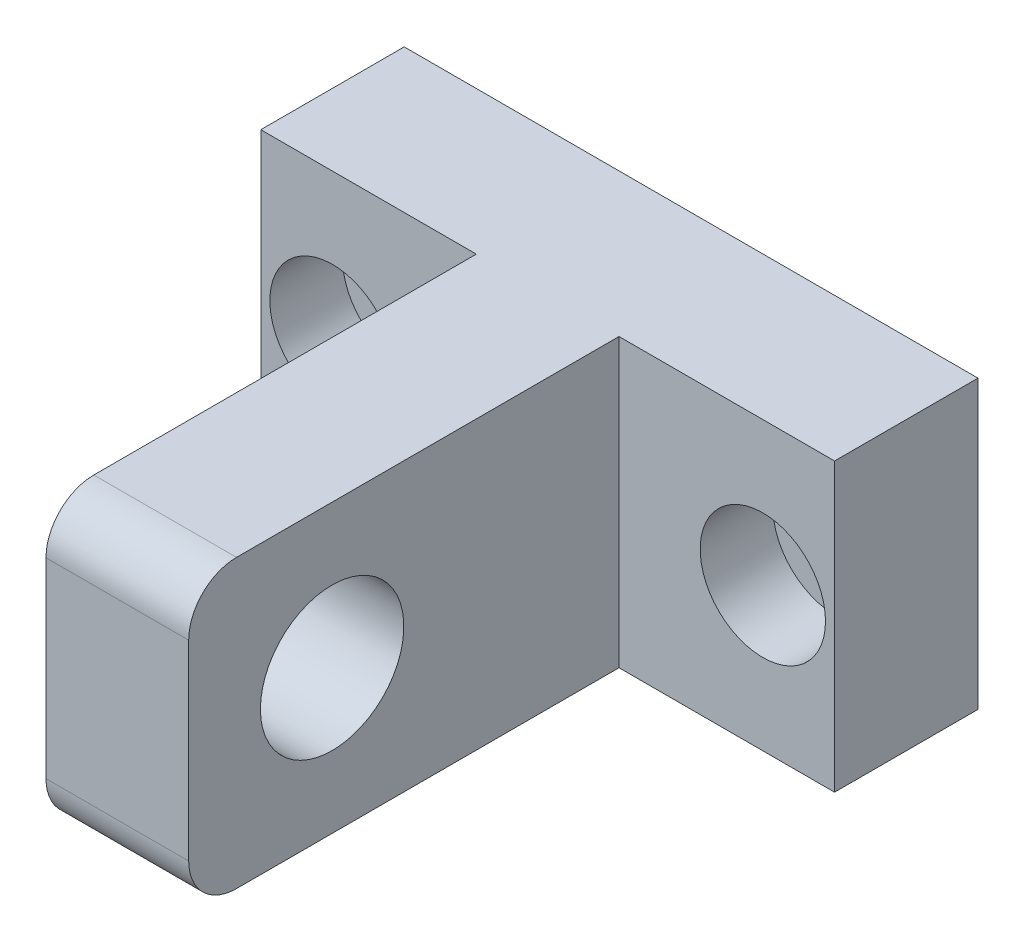
ISO-10303-21;
HEADER;
FILE_DESCRIPTION(('STEP AP214'),'2;1');
FILE_NAME('part.step','',(''),(''),'','','');
FILE_SCHEMA(('AUTOMOTIVE_DESIGN { 1 0 10303 214 1 1 1 1 }'));
ENDSEC;
DATA;
#1=APPLICATION_CONTEXT('core data for automotive mechanical design processes');
#2=APPLICATION_PROTOCOL_DEFINITION('international standard','automotive_design',2000,#1);
#3=PRODUCT_CONTEXT('',#1,'mechanical');
#4=PRODUCT('Part','Part','',(#3));
#5=PRODUCT_RELATED_PRODUCT_CATEGORY('part','',(#4));
#6=PRODUCT_DEFINITION_FORMATION('','',#4);
#7=PRODUCT_DEFINITION_CONTEXT('part definition',#1,'design');
#8=PRODUCT_DEFINITION('design','',#6,#7);
#9=PRODUCT_DEFINITION_SHAPE('','',#8);
#10=(LENGTH_UNIT() NAMED_UNIT(*) SI_UNIT(.MILLI.,.METRE.));
#11=(NAMED_UNIT(*) PLANE_ANGLE_UNIT() SI_UNIT($,.RADIAN.));
#12=(NAMED_UNIT(*) SI_UNIT($,.STERADIAN.) SOLID_ANGLE_UNIT());
#13=UNCERTAINTY_MEASURE_WITH_UNIT(LENGTH_MEASURE(1.E-05),#10,'distance_accuracy_value','');
#14=(GEOMETRIC_REPRESENTATION_CONTEXT(3) GLOBAL_UNCERTAINTY_ASSIGNED_CONTEXT((#13)) GLOBAL_UNIT_ASSIGNED_CONTEXT((#10,
#11,#12)) REPRESENTATION_CONTEXT('',''));
#15=CARTESIAN_POINT('',(0.,0.,0.));
#16=DIRECTION('',(0.,0.,1.));
#17=DIRECTION('',(1.,0.,0.));
#18=AXIS2_PLACEMENT_3D('',#15,#16,#17);
#19=CARTESIAN_POINT('',(-19.05,-9.525,9.525));
#20=DIRECTION('',(0.,0.,1.));
#21=DIRECTION('',(1.,0.,0.));
#22=AXIS2_PLACEMENT_3D('',#19,#20,#21);
#23=PLANE('',#22);
#24=CARTESIAN_POINT('',(-14.2875,0.,9.525));
#25=DIRECTION('',(0.,0.,1.));
#26=DIRECTION('',(1.,0.,0.));
#27=AXIS2_PLACEMENT_3D('',#24,#25,#26);
#28=CIRCLE('',#27,4.16052);
#29=CARTESIAN_POINT('',(-10.12698,0.,9.525));
#30=VERTEX_POINT('',#29);
#31=EDGE_CURVE('E217',#30,#30,#28,.T.);
#32=ORIENTED_EDGE('',*,*,#31,.F.);
#33=EDGE_LOOP('',(#32));
#34=FACE_BOUND('',#33,.T.);
#35=DIRECTION('',(1.,0.,0.));
#36=VECTOR('',#35,1.);
#37=CARTESIAN_POINT('',(-19.05,-9.525,9.525));
#38=LINE('',#37,#36);
#39=CARTESIAN_POINT('',(-19.05,-9.525,9.525));
#40=VERTEX_POINT('',#39);
#41=CARTESIAN_POINT('',(-4.73710000000001,-9.525,9.525));
#42=VERTEX_POINT('',#41);
#43=EDGE_CURVE('E173',#40,#42,#38,.T.);
#44=ORIENTED_EDGE('',*,*,#43,.T.);
#45=DIRECTION('',(0.,1.,0.));
#46=VECTOR('',#45,1.);
#47=CARTESIAN_POINT('',(-4.7371,9.525,9.525));
#48=LINE('',#47,#46);
#49=CARTESIAN_POINT('',(-4.73710000000001,9.525,9.525));
#50=VERTEX_POINT('',#49);
#51=EDGE_CURVE('E147',#42,#50,#48,.T.);
#52=ORIENTED_EDGE('',*,*,#51,.T.);
#53=DIRECTION('',(-1.,0.,0.));
#54=VECTOR('',#53,1.);
#55=CARTESIAN_POINT('',(-19.05,9.525,9.525));
#56=LINE('',#55,#54);
#57=CARTESIAN_POINT('',(-19.05,9.525,9.525));
#58=VERTEX_POINT('',#57);
#59=EDGE_CURVE('E124',#50,#58,#56,.T.);
#60=ORIENTED_EDGE('',*,*,#59,.T.);
#61=DIRECTION('',(0.,-1.,0.));
#62=VECTOR('',#61,1.);
#63=CARTESIAN_POINT('',(-19.05,9.525,9.525));
#64=LINE('',#63,#62);
#65=EDGE_CURVE('E227',#58,#40,#64,.T.);
#66=ORIENTED_EDGE('',*,*,#65,.T.);
#67=EDGE_LOOP('',(#44,#52,#60,#66));
#68=FACE_BOUND('',#67,.T.);
#69=ADVANCED_FACE('F34',(#34,#68),#23,.T.);
#70=CARTESIAN_POINT('',(14.2875,0.,9.525));
#71=DIRECTION('',(0.,0.,-1.));
#72=DIRECTION('',(-1.,0.,0.));
#73=AXIS2_PLACEMENT_3D('',#70,#71,#72);
#74=CYLINDRICAL_SURFACE('',#73,2.53365);
#75=CARTESIAN_POINT('',(14.2875,0.,0.));
#76=DIRECTION('',(0.,0.,1.));
#77=DIRECTION('',(1.,0.,0.));
#78=AXIS2_PLACEMENT_3D('',#75,#76,#77);
#79=CIRCLE('',#78,2.53365);
#80=CARTESIAN_POINT('',(11.75385,0.,0.));
#81=VERTEX_POINT('',#80);
#82=EDGE_CURVE('E223',#81,#81,#79,.T.);
#83=CARTESIAN_POINT('',(14.2875,0.,4.699));
#84=DIRECTION('',(0.,0.,1.));
#85=DIRECTION('',(1.,0.,0.));
#86=AXIS2_PLACEMENT_3D('',#83,#84,#85);
#87=CIRCLE('',#86,2.53365);
#88=CARTESIAN_POINT('',(11.75385,0.,4.699));
#89=VERTEX_POINT('',#88);
#90=EDGE_CURVE('E211',#89,#89,#87,.T.);
#91=CARTESIAN_POINT('',(11.75385,0.,0.));
#92=CARTESIAN_POINT('',(11.75385,0.,0.0489479166666667));
#93=CARTESIAN_POINT('',(11.75385,0.,0.0978958333333335));
#94=CARTESIAN_POINT('',(11.75385,0.,0.195791666666667));
#95=CARTESIAN_POINT('',(11.75385,0.,0.244739583333334));
#96=CARTESIAN_POINT('',(11.75385,0.,0.342635416666667));
#97=CARTESIAN_POINT('',(11.75385,0.,0.391583333333334));
#98=CARTESIAN_POINT('',(11.75385,0.,0.489479166666668));
#99=CARTESIAN_POINT('',(11.75385,0.,0.538427083333334));
#100=CARTESIAN_POINT('',(11.75385,0.,0.636322916666667));
#101=CARTESIAN_POINT('',(11.75385,0.,0.685270833333333));
#102=CARTESIAN_POINT('',(11.75385,0.,0.783166666666666));
#103=CARTESIAN_POINT('',(11.75385,0.,0.832114583333333));
#104=CARTESIAN_POINT('',(11.75385,0.,0.930010416666667));
#105=CARTESIAN_POINT('',(11.75385,0.,0.978958333333333));
#106=CARTESIAN_POINT('',(11.75385,0.,1.07685416666667));
#107=CARTESIAN_POINT('',(11.75385,0.,1.12580208333333));
#108=CARTESIAN_POINT('',(11.75385,0.,1.22369791666667));
#109=CARTESIAN_POINT('',(11.75385,0.,1.27264583333333));
#110=CARTESIAN_POINT('',(11.75385,0.,1.37054166666667));
#111=CARTESIAN_POINT('',(11.75385,0.,1.41948958333333));
#112=CARTESIAN_POINT('',(11.75385,0.,1.51738541666667));
#113=CARTESIAN_POINT('',(11.75385,0.,1.56633333333333));
#114=CARTESIAN_POINT('',(11.75385,0.,1.66422916666667));
#115=CARTESIAN_POINT('',(11.75385,0.,1.71317708333333));
#116=CARTESIAN_POINT('',(11.75385,0.,1.81107291666667));
#117=CARTESIAN_POINT('',(11.75385,0.,1.86002083333333));
#118=CARTESIAN_POINT('',(11.75385,0.,1.95791666666667));
#119=CARTESIAN_POINT('',(11.75385,0.,2.00686458333333));
#120=CARTESIAN_POINT('',(11.75385,0.,2.10476041666667));
#121=CARTESIAN_POINT('',(11.75385,0.,2.15370833333333));
#122=CARTESIAN_POINT('',(11.75385,0.,2.25160416666667));
#123=CARTESIAN_POINT('',(11.75385,0.,2.30055208333333));
#124=CARTESIAN_POINT('',(11.75385,0.,2.39844791666667));
#125=CARTESIAN_POINT('',(11.75385,0.,2.44739583333333));
#126=CARTESIAN_POINT('',(11.75385,0.,2.54529166666667));
#127=CARTESIAN_POINT('',(11.75385,0.,2.59423958333333));
#128=CARTESIAN_POINT('',(11.75385,0.,2.69213541666667));
#129=CARTESIAN_POINT('',(11.75385,0.,2.74108333333333));
#130=CARTESIAN_POINT('',(11.75385,0.,2.83897916666667));
#131=CARTESIAN_POINT('',(11.75385,0.,2.88792708333333));
#132=CARTESIAN_POINT('',(11.75385,0.,2.98582291666667));
#133=CARTESIAN_POINT('',(11.75385,0.,3.03477083333333));
#134=CARTESIAN_POINT('',(11.75385,0.,3.13266666666667));
#135=CARTESIAN_POINT('',(11.75385,0.,3.18161458333333));
#136=CARTESIAN_POINT('',(11.75385,0.,3.27951041666667));
#137=CARTESIAN_POINT('',(11.75385,0.,3.32845833333333));
#138=CARTESIAN_POINT('',(11.75385,0.,3.42635416666667));
#139=CARTESIAN_POINT('',(11.75385,0.,3.47530208333333));
#140=CARTESIAN_POINT('',(11.75385,0.,3.57319791666667));
#141=CARTESIAN_POINT('',(11.75385,0.,3.62214583333333));
#142=CARTESIAN_POINT('',(11.75385,0.,3.72004166666667));
#143=CARTESIAN_POINT('',(11.75385,0.,3.76898958333333));
#144=CARTESIAN_POINT('',(11.75385,0.,3.86688541666667));
#145=CARTESIAN_POINT('',(11.75385,0.,3.91583333333333));
#146=CARTESIAN_POINT('',(11.75385,0.,4.01372916666667));
#147=CARTESIAN_POINT('',(11.75385,0.,4.06267708333333));
#148=CARTESIAN_POINT('',(11.75385,0.,4.16057291666667));
#149=CARTESIAN_POINT('',(11.75385,0.,4.20952083333333));
#150=CARTESIAN_POINT('',(11.75385,0.,4.30741666666667));
#151=CARTESIAN_POINT('',(11.75385,0.,4.35636458333333));
#152=CARTESIAN_POINT('',(11.75385,0.,4.45426041666667));
#153=CARTESIAN_POINT('',(11.75385,0.,4.50320833333333));
#154=CARTESIAN_POINT('',(11.75385,0.,4.60110416666667));
#155=CARTESIAN_POINT('',(11.75385,0.,4.65005208333333));
#156=CARTESIAN_POINT('',(11.75385,0.,4.699));
#157=B_SPLINE_CURVE_WITH_KNOTS('',3,(#91,#92,#93,#94,#95,#96,#97,#98,#99,#100,#101,#102,#103,
#104,#105,#106,#107,#108,#109,#110,#111,#112,#113,#114,#115,#116,#117,#118,#119,#120,#121,#122,
#123,#124,#125,#126,#127,#128,#129,#130,#131,#132,#133,#134,#135,#136,#137,#138,#139,#140,#141,
#142,#143,#144,#145,#146,#147,#148,#149,#150,#151,#152,#153,#154,#155,#156),.UNSPECIFIED.,.F.,
.F.,(4,2,2,2,2,2,2,2,2,2,2,2,2,2,2,2,2,2,2,2,2,2,2,2,2,2,2,2,2,2,2,2,4),(0.,0.14684375,
0.293687500000001,0.440531250000001,0.587375000000001,0.73421875,0.8810625,1.02790625,1.17475,
1.32159375,1.4684375,1.61528125,1.762125,1.90896875,2.0558125,2.20265625,2.3495,2.49634375,
2.6431875,2.79003125,2.936875,3.08371875,3.2305625,3.37740625,3.52425,3.67109375,3.8179375,
3.96478125,4.111625,4.25846875,4.4053125,4.55215625,4.699),.UNSPECIFIED.);
#158=EDGE_CURVE('BSEAM278',#81,#89,#157,.T.);
#159=ORIENTED_EDGE('',*,*,#82,.F.);
#160=ORIENTED_EDGE('',*,*,#90,.T.);
#161=ORIENTED_EDGE('',*,*,#158,.T.);
#162=ORIENTED_EDGE('',*,*,#158,.F.);
#163=EDGE_LOOP('',(#159,#161,#160,#162));
#164=FACE_BOUND('',#163,.T.);
#165=ADVANCED_FACE('F278',(#164),#74,.F.);
#166=CARTESIAN_POINT('',(-14.2875,0.,9.525));
#167=DIRECTION('',(0.,0.,-1.));
#168=DIRECTION('',(-1.,0.,0.));
#169=AXIS2_PLACEMENT_3D('',#166,#167,#168);
#170=CYLINDRICAL_SURFACE('',#169,2.53365);
#171=CARTESIAN_POINT('',(-14.2875,0.,0.));
#172=DIRECTION('',(0.,0.,1.));
#173=DIRECTION('',(1.,0.,0.));
#174=AXIS2_PLACEMENT_3D('',#171,#172,#173);
#175=CIRCLE('',#174,2.53365);
#176=CARTESIAN_POINT('',(-16.82115,0.,0.));
#177=VERTEX_POINT('',#176);
#178=EDGE_CURVE('E220',#177,#177,#175,.T.);
#179=CARTESIAN_POINT('',(-14.2875,0.,4.699));
#180=DIRECTION('',(0.,0.,1.));
#181=DIRECTION('',(1.,0.,0.));
#182=AXIS2_PLACEMENT_3D('',#179,#180,#181);
#183=CIRCLE('',#182,2.53365);
#184=CARTESIAN_POINT('',(-16.82115,0.,4.699));
#185=VERTEX_POINT('',#184);
#186=EDGE_CURVE('E216',#185,#185,#183,.T.);
#187=CARTESIAN_POINT('',(-16.82115,0.,0.));
#188=CARTESIAN_POINT('',(-16.82115,0.,0.0489479166666667));
#189=CARTESIAN_POINT('',(-16.82115,0.,0.0978958333333335));
#190=CARTESIAN_POINT('',(-16.82115,0.,0.195791666666667));
#191=CARTESIAN_POINT('',(-16.82115,0.,0.244739583333334));
#192=CARTESIAN_POINT('',(-16.82115,0.,0.342635416666667));
#193=CARTESIAN_POINT('',(-16.82115,0.,0.391583333333334));
#194=CARTESIAN_POINT('',(-16.82115,0.,0.489479166666668));
#195=CARTESIAN_POINT('',(-16.82115,0.,0.538427083333334));
#196=CARTESIAN_POINT('',(-16.82115,0.,0.636322916666667));
#197=CARTESIAN_POINT('',(-16.82115,0.,0.685270833333333));
#198=CARTESIAN_POINT('',(-16.82115,0.,0.783166666666666));
#199=CARTESIAN_POINT('',(-16.82115,0.,0.832114583333333));
#200=CARTESIAN_POINT('',(-16.82115,0.,0.930010416666667));
#201=CARTESIAN_POINT('',(-16.82115,0.,0.978958333333333));
#202=CARTESIAN_POINT('',(-16.82115,0.,1.07685416666667));
#203=CARTESIAN_POINT('',(-16.82115,0.,1.12580208333333));
#204=CARTESIAN_POINT('',(-16.82115,0.,1.22369791666667));
#205=CARTESIAN_POINT('',(-16.82115,0.,1.27264583333333));
#206=CARTESIAN_POINT('',(-16.82115,0.,1.37054166666667));
#207=CARTESIAN_POINT('',(-16.82115,0.,1.41948958333333));
#208=CARTESIAN_POINT('',(-16.82115,0.,1.51738541666667));
#209=CARTESIAN_POINT('',(-16.82115,0.,1.56633333333333));
#210=CARTESIAN_POINT('',(-16.82115,0.,1.66422916666667));
#211=CARTESIAN_POINT('',(-16.82115,0.,1.71317708333333));
#212=CARTESIAN_POINT('',(-16.82115,0.,1.81107291666667));
#213=CARTESIAN_POINT('',(-16.82115,0.,1.86002083333333));
#214=CARTESIAN_POINT('',(-16.82115,0.,1.95791666666667));
#215=CARTESIAN_POINT('',(-16.82115,0.,2.00686458333333));
#216=CARTESIAN_POINT('',(-16.82115,0.,2.10476041666667));
#217=CARTESIAN_POINT('',(-16.82115,0.,2.15370833333333));
#218=CARTESIAN_POINT('',(-16.82115,0.,2.25160416666667));
#219=CARTESIAN_POINT('',(-16.82115,0.,2.30055208333333));
#220=CARTESIAN_POINT('',(-16.82115,0.,2.39844791666667));
#221=CARTESIAN_POINT('',(-16.82115,0.,2.44739583333333));
#222=CARTESIAN_POINT('',(-16.82115,0.,2.54529166666667));
#223=CARTESIAN_POINT('',(-16.82115,0.,2.59423958333333));
#224=CARTESIAN_POINT('',(-16.82115,0.,2.69213541666667));
#225=CARTESIAN_POINT('',(-16.82115,0.,2.74108333333333));
#226=CARTESIAN_POINT('',(-16.82115,0.,2.83897916666667));
#227=CARTESIAN_POINT('',(-16.82115,0.,2.88792708333333));
#228=CARTESIAN_POINT('',(-16.82115,0.,2.98582291666667));
#229=CARTESIAN_POINT('',(-16.82115,0.,3.03477083333333));
#230=CARTESIAN_POINT('',(-16.82115,0.,3.13266666666667));
#231=CARTESIAN_POINT('',(-16.82115,0.,3.18161458333333));
#232=CARTESIAN_POINT('',(-16.82115,0.,3.27951041666667));
#233=CARTESIAN_POINT('',(-16.82115,0.,3.32845833333333));
#234=CARTESIAN_POINT('',(-16.82115,0.,3.42635416666667));
#235=CARTESIAN_POINT('',(-16.82115,0.,3.47530208333333));
#236=CARTESIAN_POINT('',(-16.82115,0.,3.57319791666667));
#237=CARTESIAN_POINT('',(-16.82115,0.,3.62214583333333));
#238=CARTESIAN_POINT('',(-16.82115,0.,3.72004166666667));
#239=CARTESIAN_POINT('',(-16.82115,0.,3.76898958333333));
#240=CARTESIAN_POINT('',(-16.82115,0.,3.86688541666667));
#241=CARTESIAN_POINT('',(-16.82115,0.,3.91583333333333));
#242=CARTESIAN_POINT('',(-16.82115,0.,4.01372916666667));
#243=CARTESIAN_POINT('',(-16.82115,0.,4.06267708333333));
#244=CARTESIAN_POINT('',(-16.82115,0.,4.16057291666667));
#245=CARTESIAN_POINT('',(-16.82115,0.,4.20952083333333));
#246=CARTESIAN_POINT('',(-16.82115,0.,4.30741666666667));
#247=CARTESIAN_POINT('',(-16.82115,0.,4.35636458333333));
#248=CARTESIAN_POINT('',(-16.82115,0.,4.45426041666667));
#249=CARTESIAN_POINT('',(-16.82115,0.,4.50320833333333));
#250=CARTESIAN_POINT('',(-16.82115,0.,4.60110416666667));
#251=CARTESIAN_POINT('',(-16.82115,0.,4.65005208333333));
#252=CARTESIAN_POINT('',(-16.82115,0.,4.699));
#253=B_SPLINE_CURVE_WITH_KNOTS('',3,(#187,#188,#189,#190,#191,#192,#193,#194,#195,#196,#197,
#198,#199,#200,#201,#202,#203,#204,#205,#206,#207,#208,#209,#210,#211,#212,#213,#214,#215,#216,
#217,#218,#219,#220,#221,#222,#223,#224,#225,#226,#227,#228,#229,#230,#231,#232,#233,#234,#235,
#236,#237,#238,#239,#240,#241,#242,#243,#244,#245,#246,#247,#248,#249,#250,#251,#252),
.UNSPECIFIED.,.F.,.F.,(4,2,2,2,2,2,2,2,2,2,2,2,2,2,2,2,2,2,2,2,2,2,2,2,2,2,2,2,2,2,2,2,4),(0.,
0.14684375,0.293687500000001,0.440531250000001,0.587375000000001,0.73421875,0.8810625,
1.02790625,1.17475,1.32159375,1.4684375,1.61528125,1.762125,1.90896875,2.0558125,2.20265625,
2.3495,2.49634375,2.6431875,2.79003125,2.936875,3.08371875,3.2305625,3.37740625,3.52425,
3.67109375,3.8179375,3.96478125,4.111625,4.25846875,4.4053125,4.55215625,4.699),.UNSPECIFIED.);
#254=EDGE_CURVE('BSEAM284',#177,#185,#253,.T.);
#255=ORIENTED_EDGE('',*,*,#178,.F.);
#256=ORIENTED_EDGE('',*,*,#186,.T.);
#257=ORIENTED_EDGE('',*,*,#254,.T.);
#258=ORIENTED_EDGE('',*,*,#254,.F.);
#259=EDGE_LOOP('',(#255,#257,#256,#258));
#260=FACE_BOUND('',#259,.T.);
#261=ADVANCED_FACE('F284',(#260),#170,.F.);
#262=DIRECTION('',(0.,1.,0.));
#263=VECTOR('',#262,1.);
#264=CARTESIAN_POINT('',(4.7371,9.525,9.525));
#265=LINE('',#264,#263);
#266=CARTESIAN_POINT('',(4.73709999999998,-9.525,9.525));
#267=VERTEX_POINT('',#266);
#268=CARTESIAN_POINT('',(4.7371,9.525,9.525));
#269=VERTEX_POINT('',#268);
#270=EDGE_CURVE('E117',#267,#269,#265,.T.);
#271=ORIENTED_EDGE('',*,*,#270,.F.);
#272=CARTESIAN_POINT('',(19.05,-9.525,9.525));
#273=VERTEX_POINT('',#272);
#274=EDGE_CURVE('E199',#267,#273,#38,.T.);
#275=ORIENTED_EDGE('',*,*,#274,.T.);
#276=DIRECTION('',(0.,1.,0.));
#277=VECTOR('',#276,1.);
#278=CARTESIAN_POINT('',(19.05,9.525,9.525));
#279=LINE('',#278,#277);
#280=CARTESIAN_POINT('',(19.05,9.525,9.525));
#281=VERTEX_POINT('',#280);
#282=EDGE_CURVE('E120',#273,#281,#279,.T.);
#283=ORIENTED_EDGE('',*,*,#282,.T.);
#284=EDGE_CURVE('E113',#281,#269,#56,.T.);
#285=ORIENTED_EDGE('',*,*,#284,.T.);
#286=EDGE_LOOP('',(#271,#275,#283,#285));
#287=FACE_BOUND('',#286,.T.);
#288=CARTESIAN_POINT('',(14.2875,0.,9.525));
#289=DIRECTION('',(0.,0.,1.));
#290=DIRECTION('',(1.,0.,0.));
#291=AXIS2_PLACEMENT_3D('',#288,#289,#290);
#292=CIRCLE('',#291,4.16052);
#293=CARTESIAN_POINT('',(18.44802,0.,9.525));
#294=VERTEX_POINT('',#293);
#295=EDGE_CURVE('E135',#294,#294,#292,.T.);
#296=ORIENTED_EDGE('',*,*,#295,.F.);
#297=EDGE_LOOP('',(#296));
#298=FACE_BOUND('',#297,.T.);
#299=ADVANCED_FACE('F115',(#287,#298),#23,.T.);
#300=CARTESIAN_POINT('',(-19.05,-9.525,0.));
#301=DIRECTION('',(0.,0.,1.));
#302=DIRECTION('',(1.,0.,0.));
#303=AXIS2_PLACEMENT_3D('',#300,#301,#302);
#304=PLANE('',#303);
#305=ORIENTED_EDGE('',*,*,#82,.T.);
#306=EDGE_LOOP('',(#305));
#307=FACE_BOUND('',#306,.T.);
#308=DIRECTION('',(0.,-1.,0.));
#309=VECTOR('',#308,1.);
#310=CARTESIAN_POINT('',(-19.05,9.525,0.));
#311=LINE('',#310,#309);
#312=CARTESIAN_POINT('',(-19.05,9.525,0.));
#313=VERTEX_POINT('',#312);
#314=CARTESIAN_POINT('',(-19.05,-9.525,0.));
#315=VERTEX_POINT('',#314);
#316=EDGE_CURVE('E226',#313,#315,#311,.T.);
#317=ORIENTED_EDGE('',*,*,#316,.F.);
#318=DIRECTION('',(-1.,0.,0.));
#319=VECTOR('',#318,1.);
#320=CARTESIAN_POINT('',(-19.05,9.525,0.));
#321=LINE('',#320,#319);
#322=CARTESIAN_POINT('',(19.05,9.525,0.));
#323=VERTEX_POINT('',#322);
#324=EDGE_CURVE('E229',#323,#313,#321,.T.);
#325=ORIENTED_EDGE('',*,*,#324,.F.);
#326=DIRECTION('',(0.,1.,0.));
#327=VECTOR('',#326,1.);
#328=CARTESIAN_POINT('',(19.05,9.525,0.));
#329=LINE('',#328,#327);
#330=CARTESIAN_POINT('',(19.05,-9.525,0.));
#331=VERTEX_POINT('',#330);
#332=EDGE_CURVE('E250',#331,#323,#329,.T.);
#333=ORIENTED_EDGE('',*,*,#332,.F.);
#334=DIRECTION('',(1.,0.,0.));
#335=VECTOR('',#334,1.);
#336=CARTESIAN_POINT('',(-19.05,-9.525,0.));
#337=LINE('',#336,#335);
#338=EDGE_CURVE('E252',#315,#331,#337,.T.);
#339=ORIENTED_EDGE('',*,*,#338,.F.);
#340=EDGE_LOOP('',(#317,#325,#333,#339));
#341=FACE_BOUND('',#340,.T.);
#342=ORIENTED_EDGE('',*,*,#178,.T.);
#343=EDGE_LOOP('',(#342));
#344=FACE_BOUND('',#343,.T.);
#345=ADVANCED_FACE('F263',(#307,#341,#344),#304,.F.);
#346=CARTESIAN_POINT('',(-19.05,9.525,9.525));
#347=DIRECTION('',(1.,0.,0.));
#348=DIRECTION('',(0.,0.,-1.));
#349=AXIS2_PLACEMENT_3D('',#346,#347,#348);
#350=PLANE('',#349);
#351=ORIENTED_EDGE('',*,*,#316,.T.);
#352=DIRECTION('',(0.,0.,-1.));
#353=VECTOR('',#352,1.);
#354=CARTESIAN_POINT('',(-19.05,-9.525,9.525));
#355=LINE('',#354,#353);
#356=EDGE_CURVE('E188',#40,#315,#355,.T.);
#357=ORIENTED_EDGE('',*,*,#356,.F.);
#358=ORIENTED_EDGE('',*,*,#65,.F.);
#359=DIRECTION('',(0.,0.,-1.));
#360=VECTOR('',#359,1.);
#361=CARTESIAN_POINT('',(-19.05,9.525,9.525));
#362=LINE('',#361,#360);
#363=EDGE_CURVE('E123',#58,#313,#362,.T.);
#364=ORIENTED_EDGE('',*,*,#363,.T.);
#365=EDGE_LOOP('',(#351,#357,#358,#364));
#366=FACE_BOUND('',#365,.T.);
#367=ADVANCED_FACE('F260',(#366),#350,.F.);
#368=CARTESIAN_POINT('',(-19.05,-9.525,9.525));
#369=DIRECTION('',(0.,1.,0.));
#370=DIRECTION('',(0.,0.,1.));
#371=AXIS2_PLACEMENT_3D('',#368,#369,#370);
#372=PLANE('',#371);
#373=DIRECTION('',(0.,0.,-1.));
#374=VECTOR('',#373,1.);
#375=CARTESIAN_POINT('',(4.7371,-9.525,38.1));
#376=LINE('',#375,#374);
#377=CARTESIAN_POINT('',(4.7371,-9.525,34.925));
#378=VERTEX_POINT('',#377);
#379=EDGE_CURVE('E132',#378,#267,#376,.T.);
#380=ORIENTED_EDGE('',*,*,#379,.F.);
#381=DIRECTION('',(-1.,0.,0.));
#382=VECTOR('',#381,1.);
#383=CARTESIAN_POINT('',(-19.05,-9.525,34.925));
#384=LINE('',#383,#382);
#385=CARTESIAN_POINT('',(-4.7371,-9.525,34.925));
#386=VERTEX_POINT('',#385);
#387=EDGE_CURVE('E159',#378,#386,#384,.T.);
#388=ORIENTED_EDGE('',*,*,#387,.T.);
#389=DIRECTION('',(0.,0.,-1.));
#390=VECTOR('',#389,1.);
#391=CARTESIAN_POINT('',(-4.7371,-9.525,38.1));
#392=LINE('',#391,#390);
#393=EDGE_CURVE('E156',#386,#42,#392,.T.);
#394=ORIENTED_EDGE('',*,*,#393,.T.);
#395=ORIENTED_EDGE('',*,*,#43,.F.);
#396=ORIENTED_EDGE('',*,*,#356,.T.);
#397=ORIENTED_EDGE('',*,*,#338,.T.);
#398=DIRECTION('',(0.,0.,-1.));
#399=VECTOR('',#398,1.);
#400=CARTESIAN_POINT('',(19.05,-9.525,9.525));
#401=LINE('',#400,#399);
#402=EDGE_CURVE('E243',#273,#331,#401,.T.);
#403=ORIENTED_EDGE('',*,*,#402,.F.);
#404=ORIENTED_EDGE('',*,*,#274,.F.);
#405=EDGE_LOOP('',(#380,#388,#394,#395,#396,#397,#403,#404));
#406=FACE_BOUND('',#405,.T.);
#407=ADVANCED_FACE('F197',(#406),#372,.F.);
#408=CARTESIAN_POINT('',(19.05,9.525,9.525));
#409=DIRECTION('',(-1.,0.,0.));
#410=DIRECTION('',(0.,0.,1.));
#411=AXIS2_PLACEMENT_3D('',#408,#409,#410);
#412=PLANE('',#411);
#413=ORIENTED_EDGE('',*,*,#332,.T.);
#414=DIRECTION('',(0.,0.,-1.));
#415=VECTOR('',#414,1.);
#416=CARTESIAN_POINT('',(19.05,9.525,9.525));
#417=LINE('',#416,#415);
#418=EDGE_CURVE('E246',#281,#323,#417,.T.);
#419=ORIENTED_EDGE('',*,*,#418,.F.);
#420=ORIENTED_EDGE('',*,*,#282,.F.);
#421=ORIENTED_EDGE('',*,*,#402,.T.);
#422=EDGE_LOOP('',(#413,#419,#420,#421));
#423=FACE_BOUND('',#422,.T.);
#424=ADVANCED_FACE('F267',(#423),#412,.F.);
#425=CARTESIAN_POINT('',(-19.05,9.525,9.525));
#426=DIRECTION('',(0.,-1.,0.));
#427=DIRECTION('',(0.,0.,-1.));
#428=AXIS2_PLACEMENT_3D('',#425,#426,#427);
#429=PLANE('',#428);
#430=DIRECTION('',(0.,0.,1.));
#431=VECTOR('',#430,1.);
#432=CARTESIAN_POINT('',(-4.7371,9.525,38.1));
#433=LINE('',#432,#431);
#434=CARTESIAN_POINT('',(-4.7371,9.525,34.925));
#435=VERTEX_POINT('',#434);
#436=EDGE_CURVE('E162',#50,#435,#433,.T.);
#437=ORIENTED_EDGE('',*,*,#436,.T.);
#438=DIRECTION('',(-1.,0.,0.));
#439=VECTOR('',#438,1.);
#440=CARTESIAN_POINT('',(-19.05,9.525,34.925));
#441=LINE('',#440,#439);
#442=CARTESIAN_POINT('',(4.7371,9.525,34.925));
#443=VERTEX_POINT('',#442);
#444=EDGE_CURVE('E11',#435,#443,#441,.F.);
#445=ORIENTED_EDGE('',*,*,#444,.T.);
#446=DIRECTION('',(0.,0.,1.));
#447=VECTOR('',#446,1.);
#448=CARTESIAN_POINT('',(4.7371,9.525,38.1));
#449=LINE('',#448,#447);
#450=EDGE_CURVE('E129',#269,#443,#449,.T.);
#451=ORIENTED_EDGE('',*,*,#450,.F.);
#452=ORIENTED_EDGE('',*,*,#284,.F.);
#453=ORIENTED_EDGE('',*,*,#418,.T.);
#454=ORIENTED_EDGE('',*,*,#324,.T.);
#455=ORIENTED_EDGE('',*,*,#363,.F.);
#456=ORIENTED_EDGE('',*,*,#59,.F.);
#457=EDGE_LOOP('',(#437,#445,#451,#452,#453,#454,#455,#456));
#458=FACE_BOUND('',#457,.T.);
#459=ADVANCED_FACE('F134',(#458),#429,.F.);
#460=CARTESIAN_POINT('',(-14.2875,0.,4.699));
#461=DIRECTION('',(0.,0.,1.));
#462=DIRECTION('',(1.,0.,0.));
#463=AXIS2_PLACEMENT_3D('',#460,#461,#462);
#464=CYLINDRICAL_SURFACE('',#463,4.16052);
#465=CARTESIAN_POINT('',(-14.2875,0.,4.699));
#466=DIRECTION('',(0.,0.,1.));
#467=DIRECTION('',(1.,0.,0.));
#468=AXIS2_PLACEMENT_3D('',#465,#466,#467);
#469=CIRCLE('',#468,4.16052);
#470=CARTESIAN_POINT('',(-10.12698,0.,4.699));
#471=VERTEX_POINT('',#470);
#472=EDGE_CURVE('E213',#471,#471,#469,.T.);
#473=ORIENTED_EDGE('',*,*,#472,.F.);
#474=EDGE_LOOP('',(#473));
#475=FACE_BOUND('',#474,.T.);
#476=ORIENTED_EDGE('',*,*,#31,.T.);
#477=EDGE_LOOP('',(#476));
#478=FACE_BOUND('',#477,.T.);
#479=ADVANCED_FACE('F274',(#475,#478),#464,.F.);
#480=CARTESIAN_POINT('',(-14.2875,0.,4.699));
#481=DIRECTION('',(0.,0.,1.));
#482=DIRECTION('',(1.,0.,0.));
#483=AXIS2_PLACEMENT_3D('',#480,#481,#482);
#484=PLANE('',#483);
#485=ORIENTED_EDGE('',*,*,#186,.F.);
#486=EDGE_LOOP('',(#485));
#487=FACE_BOUND('',#486,.T.);
#488=ORIENTED_EDGE('',*,*,#472,.T.);
#489=EDGE_LOOP('',(#488));
#490=FACE_BOUND('',#489,.T.);
#491=ADVANCED_FACE('F304',(#487,#490),#484,.T.);
#492=CARTESIAN_POINT('',(14.2875,0.,4.699));
#493=DIRECTION('',(0.,0.,1.));
#494=DIRECTION('',(1.,0.,0.));
#495=AXIS2_PLACEMENT_3D('',#492,#493,#494);
#496=CYLINDRICAL_SURFACE('',#495,4.16052);
#497=CARTESIAN_POINT('',(14.2875,0.,4.699));
#498=DIRECTION('',(0.,0.,1.));
#499=DIRECTION('',(1.,0.,0.));
#500=AXIS2_PLACEMENT_3D('',#497,#498,#499);
#501=CIRCLE('',#500,4.16052);
#502=CARTESIAN_POINT('',(18.44802,0.,4.699));
#503=VERTEX_POINT('',#502);
#504=EDGE_CURVE('E138',#503,#503,#501,.T.);
#505=ORIENTED_EDGE('',*,*,#504,.F.);
#506=EDGE_LOOP('',(#505));
#507=FACE_BOUND('',#506,.T.);
#508=ORIENTED_EDGE('',*,*,#295,.T.);
#509=EDGE_LOOP('',(#508));
#510=FACE_BOUND('',#509,.T.);
#511=ADVANCED_FACE('F308',(#507,#510),#496,.F.);
#512=CARTESIAN_POINT('',(14.2875,0.,4.699));
#513=DIRECTION('',(0.,0.,1.));
#514=DIRECTION('',(1.,0.,0.));
#515=AXIS2_PLACEMENT_3D('',#512,#513,#514);
#516=PLANE('',#515);
#517=ORIENTED_EDGE('',*,*,#90,.F.);
#518=EDGE_LOOP('',(#517));
#519=FACE_BOUND('',#518,.T.);
#520=ORIENTED_EDGE('',*,*,#504,.T.);
#521=EDGE_LOOP('',(#520));
#522=FACE_BOUND('',#521,.T.);
#523=ADVANCED_FACE('F312',(#519,#522),#516,.T.);
#524=CARTESIAN_POINT('',(4.7371,-9.525,38.1));
#525=DIRECTION('',(1.,0.,0.));
#526=DIRECTION('',(0.,0.,-1.));
#527=AXIS2_PLACEMENT_3D('',#524,#525,#526);
#528=PLANE('',#527);
#529=DIRECTION('',(0.,-1.,0.));
#530=VECTOR('',#529,1.);
#531=CARTESIAN_POINT('',(4.7371,9.525,38.1));
#532=LINE('',#531,#530);
#533=CARTESIAN_POINT('',(4.7371,6.35,38.1));
#534=VERTEX_POINT('',#533);
#535=CARTESIAN_POINT('',(4.7371,-6.34999999999999,38.1));
#536=VERTEX_POINT('',#535);
#537=EDGE_CURVE('E153',#534,#536,#532,.T.);
#538=ORIENTED_EDGE('',*,*,#537,.T.);
#539=CARTESIAN_POINT('',(4.7371,-6.35,34.925));
#540=DIRECTION('',(1.,0.,0.));
#541=DIRECTION('',(0.,0.,-1.));
#542=AXIS2_PLACEMENT_3D('',#539,#540,#541);
#543=CIRCLE('',#542,3.175);
#544=EDGE_CURVE('E42',#536,#378,#543,.T.);
#545=ORIENTED_EDGE('',*,*,#544,.T.);
#546=ORIENTED_EDGE('',*,*,#379,.T.);
#547=ORIENTED_EDGE('',*,*,#270,.T.);
#548=ORIENTED_EDGE('',*,*,#450,.T.);
#549=CARTESIAN_POINT('',(4.7371,6.35,34.925));
#550=DIRECTION('',(1.,0.,0.));
#551=DIRECTION('',(0.,0.,-1.));
#552=AXIS2_PLACEMENT_3D('',#549,#550,#551);
#553=CIRCLE('',#552,3.175);
#554=EDGE_CURVE('E192',#443,#534,#553,.T.);
#555=ORIENTED_EDGE('',*,*,#554,.T.);
#556=EDGE_LOOP('',(#538,#545,#546,#547,#548,#555));
#557=FACE_BOUND('',#556,.T.);
#558=CARTESIAN_POINT('',(4.7371,0.,28.575));
#559=DIRECTION('',(1.,0.,0.));
#560=DIRECTION('',(0.,0.,-1.));
#561=AXIS2_PLACEMENT_3D('',#558,#559,#560);
#562=CIRCLE('',#561,4.7625);
#563=CARTESIAN_POINT('',(4.7371,0.,33.3375));
#564=VERTEX_POINT('',#563);
#565=EDGE_CURVE('E163',#564,#564,#562,.T.);
#566=ORIENTED_EDGE('',*,*,#565,.F.);
#567=EDGE_LOOP('',(#566));
#568=FACE_BOUND('',#567,.T.);
#569=ADVANCED_FACE('F127',(#557,#568),#528,.T.);
#570=CARTESIAN_POINT('',(4.7371,9.525,38.1));
#571=DIRECTION('',(0.,0.,-1.));
#572=DIRECTION('',(-1.,0.,0.));
#573=AXIS2_PLACEMENT_3D('',#570,#571,#572);
#574=PLANE('',#573);
#575=DIRECTION('',(0.,-1.,0.));
#576=VECTOR('',#575,1.);
#577=CARTESIAN_POINT('',(-4.7371,9.525,38.1));
#578=LINE('',#577,#576);
#579=CARTESIAN_POINT('',(-4.7371,6.35,38.1));
#580=VERTEX_POINT('',#579);
#581=CARTESIAN_POINT('',(-4.7371,-6.34999999999999,38.1));
#582=VERTEX_POINT('',#581);
#583=EDGE_CURVE('E158',#580,#582,#578,.T.);
#584=ORIENTED_EDGE('',*,*,#583,.T.);
#585=DIRECTION('',(-1.,0.,0.));
#586=VECTOR('',#585,1.);
#587=CARTESIAN_POINT('',(4.7371,-6.35,38.1));
#588=LINE('',#587,#586);
#589=EDGE_CURVE('E55',#582,#536,#588,.F.);
#590=ORIENTED_EDGE('',*,*,#589,.T.);
#591=ORIENTED_EDGE('',*,*,#537,.F.);
#592=DIRECTION('',(-1.,0.,0.));
#593=VECTOR('',#592,1.);
#594=CARTESIAN_POINT('',(4.7371,6.35,38.1));
#595=LINE('',#594,#593);
#596=EDGE_CURVE('E185',#534,#580,#595,.T.);
#597=ORIENTED_EDGE('',*,*,#596,.T.);
#598=EDGE_LOOP('',(#584,#590,#591,#597));
#599=FACE_BOUND('',#598,.T.);
#600=ADVANCED_FACE('F201',(#599),#574,.F.);
#601=CARTESIAN_POINT('',(4.7371,0.,28.575));
#602=DIRECTION('',(-1.,0.,0.));
#603=DIRECTION('',(0.,0.,1.));
#604=AXIS2_PLACEMENT_3D('',#601,#602,#603);
#605=CYLINDRICAL_SURFACE('',#604,4.7625);
#606=CARTESIAN_POINT('',(-4.7371,0.,28.575));
#607=DIRECTION('',(1.,0.,0.));
#608=DIRECTION('',(0.,0.,-1.));
#609=AXIS2_PLACEMENT_3D('',#606,#607,#608);
#610=CIRCLE('',#609,4.7625);
#611=CARTESIAN_POINT('',(-4.7371,0.,33.3375));
#612=VERTEX_POINT('',#611);
#613=EDGE_CURVE('E202',#612,#612,#610,.T.);
#614=CARTESIAN_POINT('',(4.7371,0.,33.3375));
#615=CARTESIAN_POINT('',(4.63841041666667,0.,33.3375));
#616=CARTESIAN_POINT('',(4.53972083333333,0.,33.3375));
#617=CARTESIAN_POINT('',(4.34234166666667,0.,33.3375));
#618=CARTESIAN_POINT('',(4.24365208333333,0.,33.3375));
#619=CARTESIAN_POINT('',(4.04627291666667,0.,33.3375));
#620=CARTESIAN_POINT('',(3.94758333333333,0.,33.3375));
#621=CARTESIAN_POINT('',(3.75020416666667,0.,33.3375));
#622=CARTESIAN_POINT('',(3.65151458333333,0.,33.3375));
#623=CARTESIAN_POINT('',(3.45413541666667,0.,33.3375));
#624=CARTESIAN_POINT('',(3.35544583333333,0.,33.3375));
#625=CARTESIAN_POINT('',(3.15806666666667,0.,33.3375));
#626=CARTESIAN_POINT('',(3.05937708333333,0.,33.3375));
#627=CARTESIAN_POINT('',(2.86199791666667,0.,33.3375));
#628=CARTESIAN_POINT('',(2.76330833333333,0.,33.3375));
#629=CARTESIAN_POINT('',(2.56592916666667,0.,33.3375));
#630=CARTESIAN_POINT('',(2.46723958333333,0.,33.3375));
#631=CARTESIAN_POINT('',(2.26986041666667,0.,33.3375));
#632=CARTESIAN_POINT('',(2.17117083333333,0.,33.3375));
#633=CARTESIAN_POINT('',(1.97379166666667,0.,33.3375));
#634=CARTESIAN_POINT('',(1.87510208333333,0.,33.3375));
#635=CARTESIAN_POINT('',(1.67772291666667,0.,33.3375));
#636=CARTESIAN_POINT('',(1.57903333333333,0.,33.3375));
#637=CARTESIAN_POINT('',(1.38165416666667,0.,33.3375));
#638=CARTESIAN_POINT('',(1.28296458333333,0.,33.3375));
#639=CARTESIAN_POINT('',(1.08558541666667,0.,33.3375));
#640=CARTESIAN_POINT('',(0.986895833333332,0.,33.3375));
#641=CARTESIAN_POINT('',(0.789516666666665,0.,33.3375));
#642=CARTESIAN_POINT('',(0.690827083333332,0.,33.3375));
#643=CARTESIAN_POINT('',(0.493447916666665,0.,33.3375));
#644=CARTESIAN_POINT('',(0.394758333333331,0.,33.3375));
#645=CARTESIAN_POINT('',(0.197379166666665,0.,33.3375));
#646=CARTESIAN_POINT('',(0.0986895833333315,0.,33.3375));
#647=CARTESIAN_POINT('',(-0.0986895833333349,0.,33.3375));
#648=CARTESIAN_POINT('',(-0.197379166666668,0.,33.3375));
#649=CARTESIAN_POINT('',(-0.394758333333335,0.,33.3375));
#650=CARTESIAN_POINT('',(-0.493447916666668,0.,33.3375));
#651=CARTESIAN_POINT('',(-0.690827083333335,0.,33.3375));
#652=CARTESIAN_POINT('',(-0.789516666666669,0.,33.3375));
#653=CARTESIAN_POINT('',(-0.986895833333336,0.,33.3375));
#654=CARTESIAN_POINT('',(-1.08558541666667,0.,33.3375));
#655=CARTESIAN_POINT('',(-1.28296458333334,0.,33.3375));
#656=CARTESIAN_POINT('',(-1.38165416666667,0.,33.3375));
#657=CARTESIAN_POINT('',(-1.57903333333334,0.,33.3375));
#658=CARTESIAN_POINT('',(-1.67772291666667,0.,33.3375));
#659=CARTESIAN_POINT('',(-1.87510208333334,0.,33.3375));
#660=CARTESIAN_POINT('',(-1.97379166666667,0.,33.3375));
#661=CARTESIAN_POINT('',(-2.17117083333334,0.,33.3375));
#662=CARTESIAN_POINT('',(-2.26986041666667,0.,33.3375));
#663=CARTESIAN_POINT('',(-2.46723958333334,0.,33.3375));
#664=CARTESIAN_POINT('',(-2.56592916666667,0.,33.3375));
#665=CARTESIAN_POINT('',(-2.76330833333334,0.,33.3375));
#666=CARTESIAN_POINT('',(-2.86199791666667,0.,33.3375));
#667=CARTESIAN_POINT('',(-3.05937708333334,0.,33.3375));
#668=CARTESIAN_POINT('',(-3.15806666666667,0.,33.3375));
#669=CARTESIAN_POINT('',(-3.35544583333333,0.,33.3375));
#670=CARTESIAN_POINT('',(-3.45413541666667,0.,33.3375));
#671=CARTESIAN_POINT('',(-3.65151458333333,0.,33.3375));
#672=CARTESIAN_POINT('',(-3.75020416666667,0.,33.3375));
#673=CARTESIAN_POINT('',(-3.94758333333333,0.,33.3375));
#674=CARTESIAN_POINT('',(-4.04627291666667,0.,33.3375));
#675=CARTESIAN_POINT('',(-4.24365208333333,0.,33.3375));
#676=CARTESIAN_POINT('',(-4.34234166666667,0.,33.3375));
#677=CARTESIAN_POINT('',(-4.53972083333333,0.,33.3375));
#678=CARTESIAN_POINT('',(-4.63841041666667,0.,33.3375));
#679=CARTESIAN_POINT('',(-4.7371,0.,33.3375));
#680=B_SPLINE_CURVE_WITH_KNOTS('',3,(#614,#615,#616,#617,#618,#619,#620,#621,#622,#623,#624,
#625,#626,#627,#628,#629,#630,#631,#632,#633,#634,#635,#636,#637,#638,#639,#640,#641,#642,#643,
#644,#645,#646,#647,#648,#649,#650,#651,#652,#653,#654,#655,#656,#657,#658,#659,#660,#661,#662,
#663,#664,#665,#666,#667,#668,#669,#670,#671,#672,#673,#674,#675,#676,#677,#678,#679),
.UNSPECIFIED.,.F.,.F.,(4,2,2,2,2,2,2,2,2,2,2,2,2,2,2,2,2,2,2,2,2,2,2,2,2,2,2,2,2,2,2,2,4),(0.,
0.29606875,0.592137499999999,0.88820625,1.184275,1.48034375,1.7764125,2.07248125,2.36855,
2.66461875,2.9606875,3.25675625,3.552825,3.84889375,4.1449625,4.44103125,4.7371,5.03316875,
5.3292375,5.62530625,5.921375,6.21744375,6.5135125,6.80958125,7.10565,7.40171875,7.6977875,
7.99385625,8.289925,8.58599375,8.8820625,9.17813125,9.4742),.UNSPECIFIED.);
#681=EDGE_CURVE('BSEAM319',#564,#612,#680,.T.);
#682=ORIENTED_EDGE('',*,*,#565,.T.);
#683=ORIENTED_EDGE('',*,*,#613,.F.);
#684=ORIENTED_EDGE('',*,*,#681,.T.);
#685=ORIENTED_EDGE('',*,*,#681,.F.);
#686=EDGE_LOOP('',(#682,#684,#683,#685));
#687=FACE_BOUND('',#686,.T.);
#688=ADVANCED_FACE('F319',(#687),#605,.F.);
#689=CARTESIAN_POINT('',(-4.7371,-9.525,38.1));
#690=DIRECTION('',(1.,0.,0.));
#691=DIRECTION('',(0.,0.,-1.));
#692=AXIS2_PLACEMENT_3D('',#689,#690,#691);
#693=PLANE('',#692);
#694=ORIENTED_EDGE('',*,*,#613,.T.);
#695=EDGE_LOOP('',(#694));
#696=FACE_BOUND('',#695,.T.);
#697=ORIENTED_EDGE('',*,*,#393,.F.);
#698=CARTESIAN_POINT('',(-4.7371,-6.35,34.925));
#699=DIRECTION('',(1.,0.,0.));
#700=DIRECTION('',(0.,0.,-1.));
#701=AXIS2_PLACEMENT_3D('',#698,#699,#700);
#702=CIRCLE('',#701,3.175);
#703=EDGE_CURVE('E184',#386,#582,#702,.F.);
#704=ORIENTED_EDGE('',*,*,#703,.T.);
#705=ORIENTED_EDGE('',*,*,#583,.F.);
#706=CARTESIAN_POINT('',(-4.7371,6.35,34.925));
#707=DIRECTION('',(1.,0.,0.));
#708=DIRECTION('',(0.,0.,-1.));
#709=AXIS2_PLACEMENT_3D('',#706,#707,#708);
#710=CIRCLE('',#709,3.175);
#711=EDGE_CURVE('E180',#580,#435,#710,.F.);
#712=ORIENTED_EDGE('',*,*,#711,.T.);
#713=ORIENTED_EDGE('',*,*,#436,.F.);
#714=ORIENTED_EDGE('',*,*,#51,.F.);
#715=EDGE_LOOP('',(#697,#704,#705,#712,#713,#714));
#716=FACE_BOUND('',#715,.T.);
#717=ADVANCED_FACE('F178',(#696,#716),#693,.F.);
#718=CARTESIAN_POINT('',(-19.05,-6.35,34.925));
#719=DIRECTION('',(-1.,0.,0.));
#720=DIRECTION('',(0.,0.,1.));
#721=AXIS2_PLACEMENT_3D('',#718,#719,#720);
#722=CYLINDRICAL_SURFACE('',#721,3.175);
#723=ORIENTED_EDGE('',*,*,#544,.F.);
#724=ORIENTED_EDGE('',*,*,#589,.F.);
#725=ORIENTED_EDGE('',*,*,#703,.F.);
#726=ORIENTED_EDGE('',*,*,#387,.F.);
#727=EDGE_LOOP('',(#723,#724,#725,#726));
#728=FACE_BOUND('',#727,.T.);
#729=ADVANCED_FACE('F200',(#728),#722,.T.);
#730=CARTESIAN_POINT('',(4.7371,6.35,34.925));
#731=DIRECTION('',(-1.,0.,0.));
#732=DIRECTION('',(0.,0.,1.));
#733=AXIS2_PLACEMENT_3D('',#730,#731,#732);
#734=CYLINDRICAL_SURFACE('',#733,3.175);
#735=ORIENTED_EDGE('',*,*,#554,.F.);
#736=ORIENTED_EDGE('',*,*,#444,.F.);
#737=ORIENTED_EDGE('',*,*,#711,.F.);
#738=ORIENTED_EDGE('',*,*,#596,.F.);
#739=EDGE_LOOP('',(#735,#736,#737,#738));
#740=FACE_BOUND('',#739,.T.);
#741=ADVANCED_FACE('F36',(#740),#734,.T.);
#742=CLOSED_SHELL('',(#69,#165,#261,#299,#345,#367,#407,#424,#459,#479,#491,#511,#523,#569,#600,
#688,#717,#729,#741));
#743=MANIFOLD_SOLID_BREP('B2',#742);
#744=ADVANCED_BREP_SHAPE_REPRESENTATION('',(#18,#743),#14);
#745=SHAPE_DEFINITION_REPRESENTATION(#9,#744);
ENDSEC;
END-ISO-10303-21;
